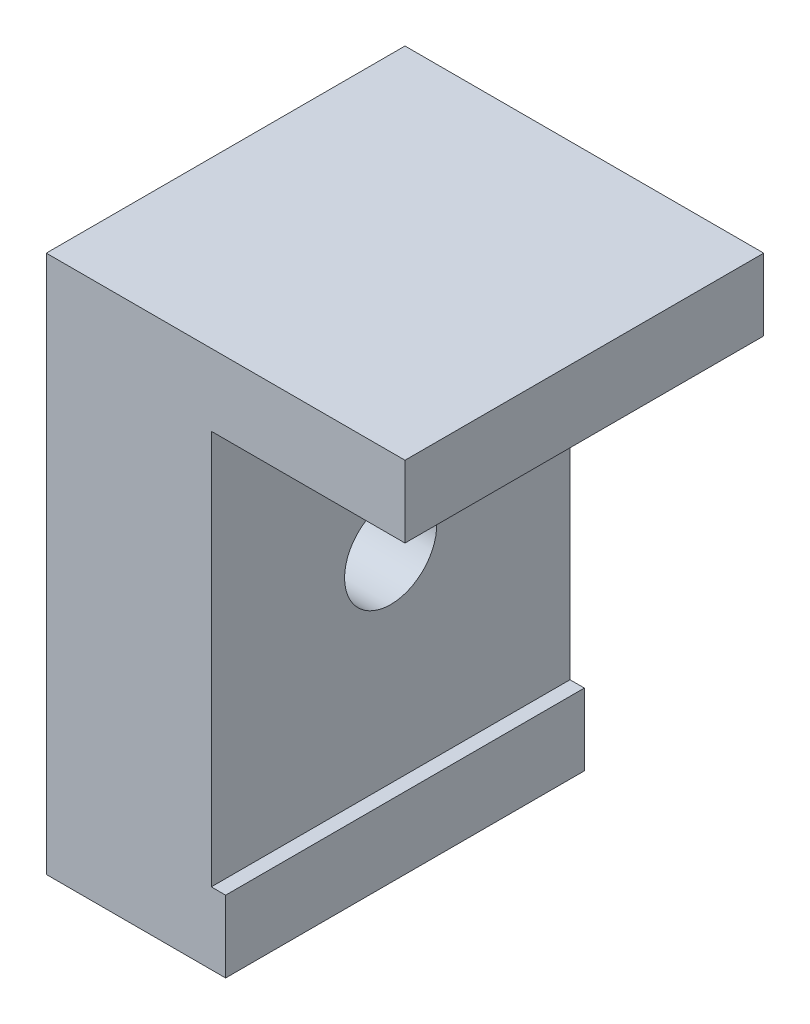
ISO-10303-21;
HEADER;
FILE_DESCRIPTION(('STEP AP214'),'2;1');
FILE_NAME('part.step','',(''),(''),'','','');
FILE_SCHEMA(('AUTOMOTIVE_DESIGN { 1 0 10303 214 1 1 1 1 }'));
ENDSEC;
DATA;
#1=APPLICATION_CONTEXT('core data for automotive mechanical design processes');
#2=APPLICATION_PROTOCOL_DEFINITION('international standard','automotive_design',2000,#1);
#3=PRODUCT_CONTEXT('',#1,'mechanical');
#4=PRODUCT('Part','Part','',(#3));
#5=PRODUCT_RELATED_PRODUCT_CATEGORY('part','',(#4));
#6=PRODUCT_DEFINITION_FORMATION('','',#4);
#7=PRODUCT_DEFINITION_CONTEXT('part definition',#1,'design');
#8=PRODUCT_DEFINITION('design','',#6,#7);
#9=PRODUCT_DEFINITION_SHAPE('','',#8);
#10=(LENGTH_UNIT() NAMED_UNIT(*) SI_UNIT(.MILLI.,.METRE.));
#11=(NAMED_UNIT(*) PLANE_ANGLE_UNIT() SI_UNIT($,.RADIAN.));
#12=(NAMED_UNIT(*) SI_UNIT($,.STERADIAN.) SOLID_ANGLE_UNIT());
#13=UNCERTAINTY_MEASURE_WITH_UNIT(LENGTH_MEASURE(1.E-05),#10,'distance_accuracy_value','');
#14=(GEOMETRIC_REPRESENTATION_CONTEXT(3) GLOBAL_UNCERTAINTY_ASSIGNED_CONTEXT((#13)) GLOBAL_UNIT_ASSIGNED_CONTEXT((#10,
#11,#12)) REPRESENTATION_CONTEXT('',''));
#15=CARTESIAN_POINT('',(0.,0.,0.));
#16=DIRECTION('',(0.,0.,1.));
#17=DIRECTION('',(1.,0.,0.));
#18=AXIS2_PLACEMENT_3D('',#15,#16,#17);
#19=CARTESIAN_POINT('',(12.7,-9.525,-6.35));
#20=DIRECTION('',(0.,0.,1.));
#21=DIRECTION('',(1.,0.,0.));
#22=AXIS2_PLACEMENT_3D('',#19,#20,#21);
#23=PLANE('',#22);
#24=DIRECTION('',(0.,-1.,0.));
#25=VECTOR('',#24,1.);
#26=CARTESIAN_POINT('',(5.842,-6.985,-6.35));
#27=LINE('',#26,#25);
#28=CARTESIAN_POINT('',(5.84199999999999,6.985,-6.35));
#29=VERTEX_POINT('',#28);
#30=CARTESIAN_POINT('',(5.842,-6.985,-6.35));
#31=VERTEX_POINT('',#30);
#32=EDGE_CURVE('E146',#29,#31,#27,.T.);
#33=ORIENTED_EDGE('',*,*,#32,.T.);
#34=DIRECTION('',(1.,0.,0.));
#35=VECTOR('',#34,1.);
#36=CARTESIAN_POINT('',(6.35,-6.985,-6.35));
#37=LINE('',#36,#35);
#38=CARTESIAN_POINT('',(6.35,-6.985,-6.35));
#39=VERTEX_POINT('',#38);
#40=EDGE_CURVE('E138',#31,#39,#37,.T.);
#41=ORIENTED_EDGE('',*,*,#40,.T.);
#42=DIRECTION('',(0.,-1.,0.));
#43=VECTOR('',#42,1.);
#44=CARTESIAN_POINT('',(6.35,-9.525,-6.35));
#45=LINE('',#44,#43);
#46=CARTESIAN_POINT('',(6.35,-9.525,-6.35));
#47=VERTEX_POINT('',#46);
#48=EDGE_CURVE('E84',#39,#47,#45,.T.);
#49=ORIENTED_EDGE('',*,*,#48,.T.);
#50=DIRECTION('',(-1.,0.,0.));
#51=VECTOR('',#50,1.);
#52=CARTESIAN_POINT('',(12.7,-9.525,-6.35));
#53=LINE('',#52,#51);
#54=CARTESIAN_POINT('',(0.,-9.525,-6.35));
#55=VERTEX_POINT('',#54);
#56=EDGE_CURVE('E76',#47,#55,#53,.T.);
#57=ORIENTED_EDGE('',*,*,#56,.T.);
#58=DIRECTION('',(0.,1.,0.));
#59=VECTOR('',#58,1.);
#60=CARTESIAN_POINT('',(0.,-9.525,-6.35));
#61=LINE('',#60,#59);
#62=CARTESIAN_POINT('',(0.,9.525,-6.35));
#63=VERTEX_POINT('',#62);
#64=EDGE_CURVE('E81',#55,#63,#61,.T.);
#65=ORIENTED_EDGE('',*,*,#64,.T.);
#66=DIRECTION('',(-1.,0.,0.));
#67=VECTOR('',#66,1.);
#68=CARTESIAN_POINT('',(12.7,9.525,-6.35));
#69=LINE('',#68,#67);
#70=CARTESIAN_POINT('',(12.7,9.525,-6.35));
#71=VERTEX_POINT('',#70);
#72=EDGE_CURVE('E11',#71,#63,#69,.T.);
#73=ORIENTED_EDGE('',*,*,#72,.F.);
#74=DIRECTION('',(0.,1.,0.));
#75=VECTOR('',#74,1.);
#76=CARTESIAN_POINT('',(12.7,-9.525,-6.35));
#77=LINE('',#76,#75);
#78=CARTESIAN_POINT('',(12.7,6.98499999999999,-6.35));
#79=VERTEX_POINT('',#78);
#80=EDGE_CURVE('E98',#79,#71,#77,.T.);
#81=ORIENTED_EDGE('',*,*,#80,.F.);
#82=DIRECTION('',(-1.,0.,0.));
#83=VECTOR('',#82,1.);
#84=CARTESIAN_POINT('',(12.7,6.985,-6.35));
#85=LINE('',#84,#83);
#86=EDGE_CURVE('E47',#79,#29,#85,.T.);
#87=ORIENTED_EDGE('',*,*,#86,.T.);
#88=EDGE_LOOP('',(#33,#41,#49,#57,#65,#73,#81,#87));
#89=FACE_BOUND('',#88,.T.);
#90=ADVANCED_FACE('F33',(#89),#23,.F.);
#91=CARTESIAN_POINT('',(12.7,9.525,6.35));
#92=DIRECTION('',(0.,-1.,0.));
#93=DIRECTION('',(0.,0.,-1.));
#94=AXIS2_PLACEMENT_3D('',#91,#92,#93);
#95=PLANE('',#94);
#96=DIRECTION('',(0.,0.,1.));
#97=VECTOR('',#96,1.);
#98=CARTESIAN_POINT('',(0.,9.525,6.35));
#99=LINE('',#98,#97);
#100=CARTESIAN_POINT('',(0.,9.525,6.35));
#101=VERTEX_POINT('',#100);
#102=EDGE_CURVE('E102',#63,#101,#99,.T.);
#103=ORIENTED_EDGE('',*,*,#102,.T.);
#104=DIRECTION('',(-1.,0.,0.));
#105=VECTOR('',#104,1.);
#106=CARTESIAN_POINT('',(12.7,9.525,6.35));
#107=LINE('',#106,#105);
#108=CARTESIAN_POINT('',(12.7,9.525,6.35));
#109=VERTEX_POINT('',#108);
#110=EDGE_CURVE('E40',#109,#101,#107,.T.);
#111=ORIENTED_EDGE('',*,*,#110,.F.);
#112=DIRECTION('',(0.,0.,1.));
#113=VECTOR('',#112,1.);
#114=CARTESIAN_POINT('',(12.7,9.525,6.35));
#115=LINE('',#114,#113);
#116=EDGE_CURVE('E56',#71,#109,#115,.T.);
#117=ORIENTED_EDGE('',*,*,#116,.F.);
#118=ORIENTED_EDGE('',*,*,#72,.T.);
#119=EDGE_LOOP('',(#103,#111,#117,#118));
#120=FACE_BOUND('',#119,.T.);
#121=ADVANCED_FACE('F119',(#120),#95,.F.);
#122=CARTESIAN_POINT('',(12.7,-9.525,6.35));
#123=DIRECTION('',(0.,0.,-1.));
#124=DIRECTION('',(-1.,0.,0.));
#125=AXIS2_PLACEMENT_3D('',#122,#123,#124);
#126=PLANE('',#125);
#127=DIRECTION('',(0.,-1.,0.));
#128=VECTOR('',#127,1.);
#129=CARTESIAN_POINT('',(6.35,-9.525,6.35));
#130=LINE('',#129,#128);
#131=CARTESIAN_POINT('',(6.35,-6.985,6.35));
#132=VERTEX_POINT('',#131);
#133=CARTESIAN_POINT('',(6.35,-9.525,6.35));
#134=VERTEX_POINT('',#133);
#135=EDGE_CURVE('E125',#132,#134,#130,.T.);
#136=ORIENTED_EDGE('',*,*,#135,.F.);
#137=DIRECTION('',(1.,0.,0.));
#138=VECTOR('',#137,1.);
#139=CARTESIAN_POINT('',(6.35,-6.985,6.35));
#140=LINE('',#139,#138);
#141=CARTESIAN_POINT('',(5.842,-6.985,6.35));
#142=VERTEX_POINT('',#141);
#143=EDGE_CURVE('E143',#142,#132,#140,.T.);
#144=ORIENTED_EDGE('',*,*,#143,.F.);
#145=DIRECTION('',(0.,-1.,0.));
#146=VECTOR('',#145,1.);
#147=CARTESIAN_POINT('',(5.842,-6.985,6.35));
#148=LINE('',#147,#146);
#149=CARTESIAN_POINT('',(5.84199999999999,6.985,6.35));
#150=VERTEX_POINT('',#149);
#151=EDGE_CURVE('E147',#150,#142,#148,.T.);
#152=ORIENTED_EDGE('',*,*,#151,.F.);
#153=DIRECTION('',(-1.,0.,0.));
#154=VECTOR('',#153,1.);
#155=CARTESIAN_POINT('',(12.7,6.985,6.35));
#156=LINE('',#155,#154);
#157=CARTESIAN_POINT('',(12.7,6.985,6.35));
#158=VERTEX_POINT('',#157);
#159=EDGE_CURVE('E128',#158,#150,#156,.T.);
#160=ORIENTED_EDGE('',*,*,#159,.F.);
#161=DIRECTION('',(0.,-1.,0.));
#162=VECTOR('',#161,1.);
#163=CARTESIAN_POINT('',(12.7,-9.525,6.35));
#164=LINE('',#163,#162);
#165=EDGE_CURVE('E89',#109,#158,#164,.T.);
#166=ORIENTED_EDGE('',*,*,#165,.F.);
#167=ORIENTED_EDGE('',*,*,#110,.T.);
#168=DIRECTION('',(0.,-1.,0.));
#169=VECTOR('',#168,1.);
#170=CARTESIAN_POINT('',(0.,-9.525,6.35));
#171=LINE('',#170,#169);
#172=CARTESIAN_POINT('',(0.,-9.525,6.35));
#173=VERTEX_POINT('',#172);
#174=EDGE_CURVE('E99',#101,#173,#171,.T.);
#175=ORIENTED_EDGE('',*,*,#174,.T.);
#176=DIRECTION('',(-1.,0.,0.));
#177=VECTOR('',#176,1.);
#178=CARTESIAN_POINT('',(12.7,-9.525,6.35));
#179=LINE('',#178,#177);
#180=EDGE_CURVE('E88',#134,#173,#179,.T.);
#181=ORIENTED_EDGE('',*,*,#180,.F.);
#182=EDGE_LOOP('',(#136,#144,#152,#160,#166,#167,#175,#181));
#183=FACE_BOUND('',#182,.T.);
#184=ADVANCED_FACE('F116',(#183),#126,.F.);
#185=CARTESIAN_POINT('',(12.7,-9.525,6.35));
#186=DIRECTION('',(0.,1.,0.));
#187=DIRECTION('',(0.,0.,1.));
#188=AXIS2_PLACEMENT_3D('',#185,#186,#187);
#189=PLANE('',#188);
#190=ORIENTED_EDGE('',*,*,#56,.F.);
#191=DIRECTION('',(0.,0.,1.));
#192=VECTOR('',#191,1.);
#193=CARTESIAN_POINT('',(6.35,-9.525,-6.35));
#194=LINE('',#193,#192);
#195=EDGE_CURVE('E103',#47,#134,#194,.T.);
#196=ORIENTED_EDGE('',*,*,#195,.T.);
#197=ORIENTED_EDGE('',*,*,#180,.T.);
#198=DIRECTION('',(0.,0.,-1.));
#199=VECTOR('',#198,1.);
#200=CARTESIAN_POINT('',(0.,-9.525,6.35));
#201=LINE('',#200,#199);
#202=EDGE_CURVE('E92',#173,#55,#201,.T.);
#203=ORIENTED_EDGE('',*,*,#202,.T.);
#204=EDGE_LOOP('',(#190,#196,#197,#203));
#205=FACE_BOUND('',#204,.T.);
#206=ADVANCED_FACE('F93',(#205),#189,.F.);
#207=CARTESIAN_POINT('',(12.7,0.,0.));
#208=DIRECTION('',(-1.,0.,0.));
#209=DIRECTION('',(0.,0.,1.));
#210=AXIS2_PLACEMENT_3D('',#207,#208,#209);
#211=PLANE('',#210);
#212=ORIENTED_EDGE('',*,*,#165,.T.);
#213=DIRECTION('',(0.,0.,1.));
#214=VECTOR('',#213,1.);
#215=CARTESIAN_POINT('',(12.7,6.985,-6.35));
#216=LINE('',#215,#214);
#217=EDGE_CURVE('E106',#79,#158,#216,.T.);
#218=ORIENTED_EDGE('',*,*,#217,.F.);
#219=ORIENTED_EDGE('',*,*,#80,.T.);
#220=ORIENTED_EDGE('',*,*,#116,.T.);
#221=EDGE_LOOP('',(#212,#218,#219,#220));
#222=FACE_BOUND('',#221,.T.);
#223=ADVANCED_FACE('F164',(#222),#211,.F.);
#224=CARTESIAN_POINT('',(0.,0.,0.));
#225=DIRECTION('',(-1.,0.,0.));
#226=DIRECTION('',(0.,0.,1.));
#227=AXIS2_PLACEMENT_3D('',#224,#225,#226);
#228=PLANE('',#227);
#229=CARTESIAN_POINT('',(0.,0.126999999999999,0.));
#230=DIRECTION('',(-1.,0.,0.));
#231=DIRECTION('',(0.,0.,1.));
#232=AXIS2_PLACEMENT_3D('',#229,#230,#231);
#233=CIRCLE('',#232,1.63195);
#234=CARTESIAN_POINT('',(0.,0.126999999999999,1.63195));
#235=VERTEX_POINT('',#234);
#236=EDGE_CURVE('E155',#235,#235,#233,.T.);
#237=ORIENTED_EDGE('',*,*,#236,.F.);
#238=EDGE_LOOP('',(#237));
#239=FACE_BOUND('',#238,.T.);
#240=ORIENTED_EDGE('',*,*,#64,.F.);
#241=ORIENTED_EDGE('',*,*,#202,.F.);
#242=ORIENTED_EDGE('',*,*,#174,.F.);
#243=ORIENTED_EDGE('',*,*,#102,.F.);
#244=EDGE_LOOP('',(#240,#241,#242,#243));
#245=FACE_BOUND('',#244,.T.);
#246=ADVANCED_FACE('F101',(#239,#245),#228,.T.);
#247=CARTESIAN_POINT('',(6.35,-9.525,-6.35));
#248=DIRECTION('',(-1.,0.,0.));
#249=DIRECTION('',(0.,-1.,0.));
#250=AXIS2_PLACEMENT_3D('',#247,#248,#249);
#251=PLANE('',#250);
#252=ORIENTED_EDGE('',*,*,#48,.F.);
#253=DIRECTION('',(0.,0.,1.));
#254=VECTOR('',#253,1.);
#255=CARTESIAN_POINT('',(6.35,-6.985,-6.35));
#256=LINE('',#255,#254);
#257=EDGE_CURVE('E131',#39,#132,#256,.T.);
#258=ORIENTED_EDGE('',*,*,#257,.T.);
#259=ORIENTED_EDGE('',*,*,#135,.T.);
#260=ORIENTED_EDGE('',*,*,#195,.F.);
#261=EDGE_LOOP('',(#252,#258,#259,#260));
#262=FACE_BOUND('',#261,.T.);
#263=ADVANCED_FACE('F163',(#262),#251,.F.);
#264=CARTESIAN_POINT('',(12.7,6.985,-6.35));
#265=DIRECTION('',(0.,1.,0.));
#266=DIRECTION('',(-1.,0.,0.));
#267=AXIS2_PLACEMENT_3D('',#264,#265,#266);
#268=PLANE('',#267);
#269=ORIENTED_EDGE('',*,*,#159,.T.);
#270=DIRECTION('',(0.,0.,1.));
#271=VECTOR('',#270,1.);
#272=CARTESIAN_POINT('',(5.84199999999999,6.985,-6.35));
#273=LINE('',#272,#271);
#274=EDGE_CURVE('E134',#29,#150,#273,.T.);
#275=ORIENTED_EDGE('',*,*,#274,.F.);
#276=ORIENTED_EDGE('',*,*,#86,.F.);
#277=ORIENTED_EDGE('',*,*,#217,.T.);
#278=EDGE_LOOP('',(#269,#275,#276,#277));
#279=FACE_BOUND('',#278,.T.);
#280=ADVANCED_FACE('F170',(#279),#268,.F.);
#281=CARTESIAN_POINT('',(6.35,-6.985,-6.35));
#282=DIRECTION('',(0.,-1.,0.));
#283=DIRECTION('',(0.,0.,-1.));
#284=AXIS2_PLACEMENT_3D('',#281,#282,#283);
#285=PLANE('',#284);
#286=ORIENTED_EDGE('',*,*,#143,.T.);
#287=ORIENTED_EDGE('',*,*,#257,.F.);
#288=ORIENTED_EDGE('',*,*,#40,.F.);
#289=DIRECTION('',(0.,0.,1.));
#290=VECTOR('',#289,1.);
#291=CARTESIAN_POINT('',(5.842,-6.985,-6.35));
#292=LINE('',#291,#290);
#293=EDGE_CURVE('E137',#31,#142,#292,.T.);
#294=ORIENTED_EDGE('',*,*,#293,.T.);
#295=EDGE_LOOP('',(#286,#287,#288,#294));
#296=FACE_BOUND('',#295,.T.);
#297=ADVANCED_FACE('F218',(#296),#285,.F.);
#298=CARTESIAN_POINT('',(5.842,-6.985,-6.35));
#299=DIRECTION('',(-1.,0.,0.));
#300=DIRECTION('',(0.,-1.,0.));
#301=AXIS2_PLACEMENT_3D('',#298,#299,#300);
#302=PLANE('',#301);
#303=CARTESIAN_POINT('',(5.84199999999999,0.126999999999999,0.));
#304=DIRECTION('',(-1.,0.,0.));
#305=DIRECTION('',(0.,-1.,0.));
#306=AXIS2_PLACEMENT_3D('',#303,#304,#305);
#307=CIRCLE('',#306,1.63195);
#308=CARTESIAN_POINT('',(5.84199999999999,-1.50495,0.));
#309=VERTEX_POINT('',#308);
#310=EDGE_CURVE('E150',#309,#309,#307,.T.);
#311=ORIENTED_EDGE('',*,*,#310,.T.);
#312=EDGE_LOOP('',(#311));
#313=FACE_BOUND('',#312,.T.);
#314=ORIENTED_EDGE('',*,*,#151,.T.);
#315=ORIENTED_EDGE('',*,*,#293,.F.);
#316=ORIENTED_EDGE('',*,*,#32,.F.);
#317=ORIENTED_EDGE('',*,*,#274,.T.);
#318=EDGE_LOOP('',(#314,#315,#316,#317));
#319=FACE_BOUND('',#318,.T.);
#320=ADVANCED_FACE('F226',(#313,#319),#302,.F.);
#321=CARTESIAN_POINT('',(0.,0.126999999999999,0.));
#322=DIRECTION('',(-1.,0.,0.));
#323=DIRECTION('',(0.,0.,1.));
#324=AXIS2_PLACEMENT_3D('',#321,#322,#323);
#325=CYLINDRICAL_SURFACE('',#324,1.63195);
#326=ORIENTED_EDGE('',*,*,#236,.T.);
#327=EDGE_LOOP('',(#326));
#328=FACE_BOUND('',#327,.T.);
#329=ORIENTED_EDGE('',*,*,#310,.F.);
#330=EDGE_LOOP('',(#329));
#331=FACE_BOUND('',#330,.T.);
#332=ADVANCED_FACE('F159',(#328,#331),#325,.F.);
#333=CLOSED_SHELL('',(#90,#121,#184,#206,#223,#246,#263,#280,#297,#320,#332));
#334=MANIFOLD_SOLID_BREP('B2',#333);
#335=ADVANCED_BREP_SHAPE_REPRESENTATION('',(#18,#334),#14);
#336=SHAPE_DEFINITION_REPRESENTATION(#9,#335);
ENDSEC;
END-ISO-10303-21;
